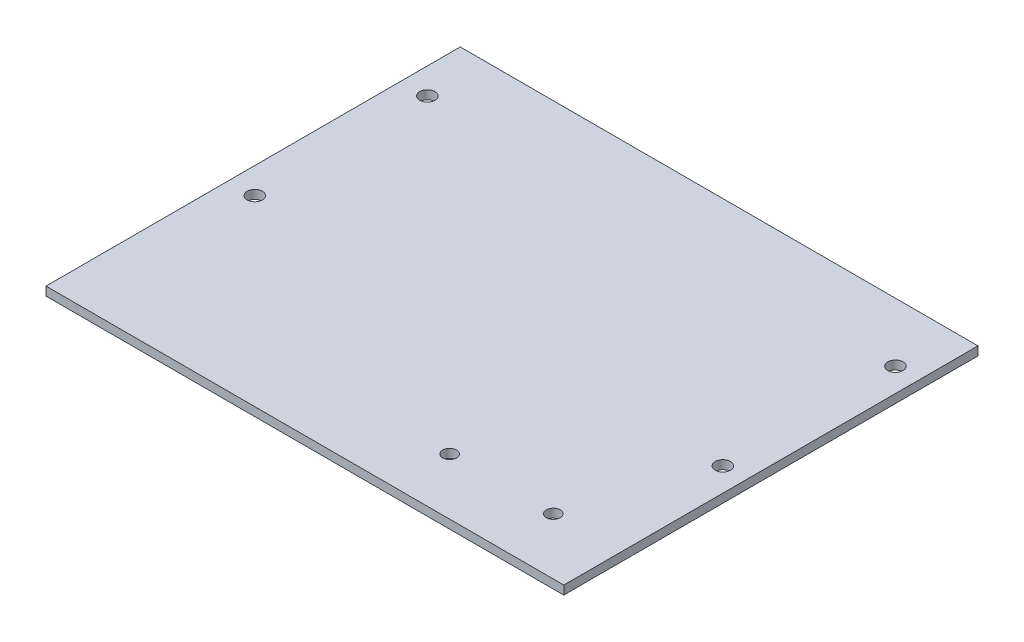
ISO-10303-21;
HEADER;
FILE_DESCRIPTION(('STEP AP214'),'2;1');
FILE_NAME('part.step','',(''),(''),'','','');
FILE_SCHEMA(('AUTOMOTIVE_DESIGN { 1 0 10303 214 1 1 1 1 }'));
ENDSEC;
DATA;
#1=APPLICATION_CONTEXT('core data for automotive mechanical design processes');
#2=APPLICATION_PROTOCOL_DEFINITION('international standard','automotive_design',2000,#1);
#3=PRODUCT_CONTEXT('',#1,'mechanical');
#4=PRODUCT('Part','Part','',(#3));
#5=PRODUCT_RELATED_PRODUCT_CATEGORY('part','',(#4));
#6=PRODUCT_DEFINITION_FORMATION('','',#4);
#7=PRODUCT_DEFINITION_CONTEXT('part definition',#1,'design');
#8=PRODUCT_DEFINITION('design','',#6,#7);
#9=PRODUCT_DEFINITION_SHAPE('','',#8);
#10=(LENGTH_UNIT() NAMED_UNIT(*) SI_UNIT(.MILLI.,.METRE.));
#11=(NAMED_UNIT(*) PLANE_ANGLE_UNIT() SI_UNIT($,.RADIAN.));
#12=(NAMED_UNIT(*) SI_UNIT($,.STERADIAN.) SOLID_ANGLE_UNIT());
#13=UNCERTAINTY_MEASURE_WITH_UNIT(LENGTH_MEASURE(1.E-05),#10,'distance_accuracy_value','');
#14=(GEOMETRIC_REPRESENTATION_CONTEXT(3) GLOBAL_UNCERTAINTY_ASSIGNED_CONTEXT((#13)) GLOBAL_UNIT_ASSIGNED_CONTEXT((#10,
#11,#12)) REPRESENTATION_CONTEXT('',''));
#15=CARTESIAN_POINT('',(0.,0.,0.));
#16=DIRECTION('',(0.,0.,1.));
#17=DIRECTION('',(1.,0.,0.));
#18=AXIS2_PLACEMENT_3D('',#15,#16,#17);
#19=CARTESIAN_POINT('',(44.6344913978495,0.,-5.38329784946236));
#20=DIRECTION('',(0.,1.,0.));
#21=DIRECTION('',(0.,0.,1.));
#22=AXIS2_PLACEMENT_3D('',#19,#20,#21);
#23=CYLINDRICAL_SURFACE('',#22,1.39700000000001);
#24=CARTESIAN_POINT('',(44.6344913978495,0.,-5.38329784946236));
#25=DIRECTION('',(0.,1.,0.));
#26=DIRECTION('',(0.,0.,1.));
#27=AXIS2_PLACEMENT_3D('',#24,#25,#26);
#28=CIRCLE('',#27,1.39700000000001);
#29=CARTESIAN_POINT('',(44.6344913978495,0.,-3.98629784946235));
#30=VERTEX_POINT('',#29);
#31=EDGE_CURVE('E41',#30,#30,#28,.T.);
#32=CARTESIAN_POINT('',(44.6344913978495,1.600000102,-5.38329784946236));
#33=DIRECTION('',(0.,1.,0.));
#34=DIRECTION('',(0.,0.,1.));
#35=AXIS2_PLACEMENT_3D('',#32,#33,#34);
#36=CIRCLE('',#35,1.39700000000001);
#37=CARTESIAN_POINT('',(44.6344913978495,1.600000102,-3.98629784946235));
#38=VERTEX_POINT('',#37);
#39=EDGE_CURVE('E11',#38,#38,#36,.T.);
#40=CARTESIAN_POINT('',(44.6344913978495,0.,-3.98629784946235));
#41=CARTESIAN_POINT('',(44.6344913978495,0.0166666677291667,-3.98629784946235));
#42=CARTESIAN_POINT('',(44.6344913978495,0.0333333354583333,-3.98629784946235));
#43=CARTESIAN_POINT('',(44.6344913978495,0.0666666709166667,-3.98629784946235));
#44=CARTESIAN_POINT('',(44.6344913978495,0.0833333386458333,-3.98629784946235));
#45=CARTESIAN_POINT('',(44.6344913978495,0.116666674104167,-3.98629784946235));
#46=CARTESIAN_POINT('',(44.6344913978495,0.133333341833333,-3.98629784946235));
#47=CARTESIAN_POINT('',(44.6344913978495,0.166666677291667,-3.98629784946235));
#48=CARTESIAN_POINT('',(44.6344913978495,0.183333345020833,-3.98629784946235));
#49=CARTESIAN_POINT('',(44.6344913978495,0.216666680479167,-3.98629784946235));
#50=CARTESIAN_POINT('',(44.6344913978495,0.233333348208333,-3.98629784946235));
#51=CARTESIAN_POINT('',(44.6344913978495,0.266666683666667,-3.98629784946235));
#52=CARTESIAN_POINT('',(44.6344913978495,0.283333351395833,-3.98629784946235));
#53=CARTESIAN_POINT('',(44.6344913978495,0.316666686854167,-3.98629784946235));
#54=CARTESIAN_POINT('',(44.6344913978495,0.333333354583333,-3.98629784946235));
#55=CARTESIAN_POINT('',(44.6344913978495,0.366666690041667,-3.98629784946235));
#56=CARTESIAN_POINT('',(44.6344913978495,0.383333357770833,-3.98629784946235));
#57=CARTESIAN_POINT('',(44.6344913978495,0.416666693229167,-3.98629784946235));
#58=CARTESIAN_POINT('',(44.6344913978495,0.433333360958333,-3.98629784946235));
#59=CARTESIAN_POINT('',(44.6344913978495,0.466666696416667,-3.98629784946235));
#60=CARTESIAN_POINT('',(44.6344913978495,0.483333364145833,-3.98629784946235));
#61=CARTESIAN_POINT('',(44.6344913978495,0.516666699604167,-3.98629784946235));
#62=CARTESIAN_POINT('',(44.6344913978495,0.533333367333333,-3.98629784946235));
#63=CARTESIAN_POINT('',(44.6344913978495,0.566666702791667,-3.98629784946235));
#64=CARTESIAN_POINT('',(44.6344913978495,0.583333370520833,-3.98629784946235));
#65=CARTESIAN_POINT('',(44.6344913978495,0.616666705979167,-3.98629784946235));
#66=CARTESIAN_POINT('',(44.6344913978495,0.633333373708333,-3.98629784946235));
#67=CARTESIAN_POINT('',(44.6344913978495,0.666666709166667,-3.98629784946235));
#68=CARTESIAN_POINT('',(44.6344913978495,0.683333376895833,-3.98629784946235));
#69=CARTESIAN_POINT('',(44.6344913978495,0.716666712354167,-3.98629784946235));
#70=CARTESIAN_POINT('',(44.6344913978495,0.733333380083333,-3.98629784946235));
#71=CARTESIAN_POINT('',(44.6344913978495,0.766666715541667,-3.98629784946235));
#72=CARTESIAN_POINT('',(44.6344913978495,0.783333383270833,-3.98629784946235));
#73=CARTESIAN_POINT('',(44.6344913978495,0.816666718729167,-3.98629784946235));
#74=CARTESIAN_POINT('',(44.6344913978495,0.833333386458333,-3.98629784946235));
#75=CARTESIAN_POINT('',(44.6344913978495,0.866666721916666,-3.98629784946235));
#76=CARTESIAN_POINT('',(44.6344913978495,0.883333389645833,-3.98629784946235));
#77=CARTESIAN_POINT('',(44.6344913978495,0.916666725104166,-3.98629784946235));
#78=CARTESIAN_POINT('',(44.6344913978495,0.933333392833333,-3.98629784946235));
#79=CARTESIAN_POINT('',(44.6344913978495,0.966666728291666,-3.98629784946235));
#80=CARTESIAN_POINT('',(44.6344913978495,0.983333396020833,-3.98629784946235));
#81=CARTESIAN_POINT('',(44.6344913978495,1.01666673147917,-3.98629784946235));
#82=CARTESIAN_POINT('',(44.6344913978495,1.03333339920833,-3.98629784946235));
#83=CARTESIAN_POINT('',(44.6344913978495,1.06666673466667,-3.98629784946235));
#84=CARTESIAN_POINT('',(44.6344913978495,1.08333340239583,-3.98629784946235));
#85=CARTESIAN_POINT('',(44.6344913978495,1.11666673785417,-3.98629784946235));
#86=CARTESIAN_POINT('',(44.6344913978495,1.13333340558333,-3.98629784946235));
#87=CARTESIAN_POINT('',(44.6344913978495,1.16666674104167,-3.98629784946235));
#88=CARTESIAN_POINT('',(44.6344913978495,1.18333340877083,-3.98629784946235));
#89=CARTESIAN_POINT('',(44.6344913978495,1.21666674422917,-3.98629784946235));
#90=CARTESIAN_POINT('',(44.6344913978495,1.23333341195833,-3.98629784946235));
#91=CARTESIAN_POINT('',(44.6344913978495,1.26666674741667,-3.98629784946235));
#92=CARTESIAN_POINT('',(44.6344913978495,1.28333341514583,-3.98629784946235));
#93=CARTESIAN_POINT('',(44.6344913978495,1.31666675060417,-3.98629784946235));
#94=CARTESIAN_POINT('',(44.6344913978495,1.33333341833333,-3.98629784946235));
#95=CARTESIAN_POINT('',(44.6344913978495,1.36666675379167,-3.98629784946235));
#96=CARTESIAN_POINT('',(44.6344913978495,1.38333342152083,-3.98629784946235));
#97=CARTESIAN_POINT('',(44.6344913978495,1.41666675697917,-3.98629784946235));
#98=CARTESIAN_POINT('',(44.6344913978495,1.43333342470833,-3.98629784946235));
#99=CARTESIAN_POINT('',(44.6344913978495,1.46666676016667,-3.98629784946235));
#100=CARTESIAN_POINT('',(44.6344913978495,1.48333342789583,-3.98629784946235));
#101=CARTESIAN_POINT('',(44.6344913978495,1.51666676335417,-3.98629784946235));
#102=CARTESIAN_POINT('',(44.6344913978495,1.53333343108333,-3.98629784946235));
#103=CARTESIAN_POINT('',(44.6344913978495,1.56666676654167,-3.98629784946235));
#104=CARTESIAN_POINT('',(44.6344913978495,1.58333343427083,-3.98629784946235));
#105=CARTESIAN_POINT('',(44.6344913978495,1.600000102,-3.98629784946235));
#106=B_SPLINE_CURVE_WITH_KNOTS('',3,(#40,#41,#42,#43,#44,#45,#46,#47,#48,#49,#50,#51,#52,#53,
#54,#55,#56,#57,#58,#59,#60,#61,#62,#63,#64,#65,#66,#67,#68,#69,#70,#71,#72,#73,#74,#75,#76,#77,
#78,#79,#80,#81,#82,#83,#84,#85,#86,#87,#88,#89,#90,#91,#92,#93,#94,#95,#96,#97,#98,#99,#100,
#101,#102,#103,#104,#105),.UNSPECIFIED.,.F.,.F.,(4,2,2,2,2,2,2,2,2,2,2,2,2,2,2,2,2,2,2,2,2,2,2,
2,2,2,2,2,2,2,2,2,4),(0.,0.0500000031875,0.100000006375,0.1500000095625,0.20000001275,
0.2500000159375,0.300000019125,0.3500000223125,0.4000000255,0.4500000286875,0.500000031875,
0.5500000350625,0.60000003825,0.6500000414375,0.700000044625,0.7500000478125,0.800000051,
0.8500000541875,0.900000057375,0.9500000605625,1.00000006375,1.0500000669375,1.100000070125,
1.1500000733125,1.2000000765,1.2500000796875,1.300000082875,1.3500000860625,1.40000008925,
1.4500000924375,1.500000095625,1.5500000988125,1.600000102),.UNSPECIFIED.);
#107=EDGE_CURVE('BSEAM33',#30,#38,#106,.T.);
#108=ORIENTED_EDGE('',*,*,#31,.F.);
#109=ORIENTED_EDGE('',*,*,#39,.T.);
#110=ORIENTED_EDGE('',*,*,#107,.T.);
#111=ORIENTED_EDGE('',*,*,#107,.F.);
#112=EDGE_LOOP('',(#108,#110,#109,#111));
#113=FACE_BOUND('',#112,.T.);
#114=ADVANCED_FACE('F33',(#113),#23,.F.);
#115=CARTESIAN_POINT('',(-41.4715086021505,0.,-5.38329784946236));
#116=DIRECTION('',(0.,1.,0.));
#117=DIRECTION('',(0.,0.,1.));
#118=AXIS2_PLACEMENT_3D('',#115,#116,#117);
#119=CYLINDRICAL_SURFACE('',#118,1.39700000000001);
#120=CARTESIAN_POINT('',(-41.4715086021505,0.,-5.38329784946236));
#121=DIRECTION('',(0.,1.,0.));
#122=DIRECTION('',(0.,0.,1.));
#123=AXIS2_PLACEMENT_3D('',#120,#121,#122);
#124=CIRCLE('',#123,1.39700000000001);
#125=CARTESIAN_POINT('',(-41.4715086021505,0.,-3.98629784946235));
#126=VERTEX_POINT('',#125);
#127=EDGE_CURVE('E111',#126,#126,#124,.T.);
#128=CARTESIAN_POINT('',(-41.4715086021505,1.600000102,-5.38329784946236));
#129=DIRECTION('',(0.,1.,0.));
#130=DIRECTION('',(0.,0.,1.));
#131=AXIS2_PLACEMENT_3D('',#128,#129,#130);
#132=CIRCLE('',#131,1.39700000000001);
#133=CARTESIAN_POINT('',(-41.4715086021505,1.600000102,-3.98629784946235));
#134=VERTEX_POINT('',#133);
#135=EDGE_CURVE('E114',#134,#134,#132,.T.);
#136=CARTESIAN_POINT('',(-41.4715086021505,0.,-3.98629784946235));
#137=CARTESIAN_POINT('',(-41.4715086021505,0.0166666677291667,-3.98629784946235));
#138=CARTESIAN_POINT('',(-41.4715086021505,0.0333333354583333,-3.98629784946235));
#139=CARTESIAN_POINT('',(-41.4715086021505,0.0666666709166667,-3.98629784946235));
#140=CARTESIAN_POINT('',(-41.4715086021505,0.0833333386458333,-3.98629784946235));
#141=CARTESIAN_POINT('',(-41.4715086021505,0.116666674104167,-3.98629784946235));
#142=CARTESIAN_POINT('',(-41.4715086021505,0.133333341833333,-3.98629784946235));
#143=CARTESIAN_POINT('',(-41.4715086021505,0.166666677291667,-3.98629784946235));
#144=CARTESIAN_POINT('',(-41.4715086021505,0.183333345020833,-3.98629784946235));
#145=CARTESIAN_POINT('',(-41.4715086021505,0.216666680479167,-3.98629784946235));
#146=CARTESIAN_POINT('',(-41.4715086021505,0.233333348208333,-3.98629784946235));
#147=CARTESIAN_POINT('',(-41.4715086021505,0.266666683666667,-3.98629784946235));
#148=CARTESIAN_POINT('',(-41.4715086021505,0.283333351395833,-3.98629784946235));
#149=CARTESIAN_POINT('',(-41.4715086021505,0.316666686854167,-3.98629784946235));
#150=CARTESIAN_POINT('',(-41.4715086021505,0.333333354583333,-3.98629784946235));
#151=CARTESIAN_POINT('',(-41.4715086021505,0.366666690041667,-3.98629784946235));
#152=CARTESIAN_POINT('',(-41.4715086021505,0.383333357770833,-3.98629784946235));
#153=CARTESIAN_POINT('',(-41.4715086021505,0.416666693229167,-3.98629784946235));
#154=CARTESIAN_POINT('',(-41.4715086021505,0.433333360958333,-3.98629784946235));
#155=CARTESIAN_POINT('',(-41.4715086021505,0.466666696416667,-3.98629784946235));
#156=CARTESIAN_POINT('',(-41.4715086021505,0.483333364145833,-3.98629784946235));
#157=CARTESIAN_POINT('',(-41.4715086021505,0.516666699604167,-3.98629784946235));
#158=CARTESIAN_POINT('',(-41.4715086021505,0.533333367333333,-3.98629784946235));
#159=CARTESIAN_POINT('',(-41.4715086021505,0.566666702791667,-3.98629784946235));
#160=CARTESIAN_POINT('',(-41.4715086021505,0.583333370520833,-3.98629784946235));
#161=CARTESIAN_POINT('',(-41.4715086021505,0.616666705979167,-3.98629784946235));
#162=CARTESIAN_POINT('',(-41.4715086021505,0.633333373708333,-3.98629784946235));
#163=CARTESIAN_POINT('',(-41.4715086021505,0.666666709166667,-3.98629784946235));
#164=CARTESIAN_POINT('',(-41.4715086021505,0.683333376895833,-3.98629784946235));
#165=CARTESIAN_POINT('',(-41.4715086021505,0.716666712354167,-3.98629784946235));
#166=CARTESIAN_POINT('',(-41.4715086021505,0.733333380083333,-3.98629784946235));
#167=CARTESIAN_POINT('',(-41.4715086021505,0.766666715541667,-3.98629784946235));
#168=CARTESIAN_POINT('',(-41.4715086021505,0.783333383270833,-3.98629784946235));
#169=CARTESIAN_POINT('',(-41.4715086021505,0.816666718729167,-3.98629784946235));
#170=CARTESIAN_POINT('',(-41.4715086021505,0.833333386458333,-3.98629784946235));
#171=CARTESIAN_POINT('',(-41.4715086021505,0.866666721916666,-3.98629784946235));
#172=CARTESIAN_POINT('',(-41.4715086021505,0.883333389645833,-3.98629784946235));
#173=CARTESIAN_POINT('',(-41.4715086021505,0.916666725104166,-3.98629784946235));
#174=CARTESIAN_POINT('',(-41.4715086021505,0.933333392833333,-3.98629784946235));
#175=CARTESIAN_POINT('',(-41.4715086021505,0.966666728291666,-3.98629784946235));
#176=CARTESIAN_POINT('',(-41.4715086021505,0.983333396020833,-3.98629784946235));
#177=CARTESIAN_POINT('',(-41.4715086021505,1.01666673147917,-3.98629784946235));
#178=CARTESIAN_POINT('',(-41.4715086021505,1.03333339920833,-3.98629784946235));
#179=CARTESIAN_POINT('',(-41.4715086021505,1.06666673466667,-3.98629784946235));
#180=CARTESIAN_POINT('',(-41.4715086021505,1.08333340239583,-3.98629784946235));
#181=CARTESIAN_POINT('',(-41.4715086021505,1.11666673785417,-3.98629784946235));
#182=CARTESIAN_POINT('',(-41.4715086021505,1.13333340558333,-3.98629784946235));
#183=CARTESIAN_POINT('',(-41.4715086021505,1.16666674104167,-3.98629784946235));
#184=CARTESIAN_POINT('',(-41.4715086021505,1.18333340877083,-3.98629784946235));
#185=CARTESIAN_POINT('',(-41.4715086021505,1.21666674422917,-3.98629784946235));
#186=CARTESIAN_POINT('',(-41.4715086021505,1.23333341195833,-3.98629784946235));
#187=CARTESIAN_POINT('',(-41.4715086021505,1.26666674741667,-3.98629784946235));
#188=CARTESIAN_POINT('',(-41.4715086021505,1.28333341514583,-3.98629784946235));
#189=CARTESIAN_POINT('',(-41.4715086021505,1.31666675060417,-3.98629784946235));
#190=CARTESIAN_POINT('',(-41.4715086021505,1.33333341833333,-3.98629784946235));
#191=CARTESIAN_POINT('',(-41.4715086021505,1.36666675379167,-3.98629784946235));
#192=CARTESIAN_POINT('',(-41.4715086021505,1.38333342152083,-3.98629784946235));
#193=CARTESIAN_POINT('',(-41.4715086021505,1.41666675697917,-3.98629784946235));
#194=CARTESIAN_POINT('',(-41.4715086021505,1.43333342470833,-3.98629784946235));
#195=CARTESIAN_POINT('',(-41.4715086021505,1.46666676016667,-3.98629784946235));
#196=CARTESIAN_POINT('',(-41.4715086021505,1.48333342789583,-3.98629784946235));
#197=CARTESIAN_POINT('',(-41.4715086021505,1.51666676335417,-3.98629784946235));
#198=CARTESIAN_POINT('',(-41.4715086021505,1.53333343108333,-3.98629784946235));
#199=CARTESIAN_POINT('',(-41.4715086021505,1.56666676654167,-3.98629784946235));
#200=CARTESIAN_POINT('',(-41.4715086021505,1.58333343427083,-3.98629784946235));
#201=CARTESIAN_POINT('',(-41.4715086021505,1.600000102,-3.98629784946235));
#202=B_SPLINE_CURVE_WITH_KNOTS('',3,(#136,#137,#138,#139,#140,#141,#142,#143,#144,#145,#146,
#147,#148,#149,#150,#151,#152,#153,#154,#155,#156,#157,#158,#159,#160,#161,#162,#163,#164,#165,
#166,#167,#168,#169,#170,#171,#172,#173,#174,#175,#176,#177,#178,#179,#180,#181,#182,#183,#184,
#185,#186,#187,#188,#189,#190,#191,#192,#193,#194,#195,#196,#197,#198,#199,#200,#201),
.UNSPECIFIED.,.F.,.F.,(4,2,2,2,2,2,2,2,2,2,2,2,2,2,2,2,2,2,2,2,2,2,2,2,2,2,2,2,2,2,2,2,4),(0.,
0.0500000031875,0.100000006375,0.1500000095625,0.20000001275,0.2500000159375,0.300000019125,
0.3500000223125,0.4000000255,0.4500000286875,0.500000031875,0.5500000350625,0.60000003825,
0.6500000414375,0.700000044625,0.7500000478125,0.800000051,0.8500000541875,0.900000057375,
0.9500000605625,1.00000006375,1.0500000669375,1.100000070125,1.1500000733125,1.2000000765,
1.2500000796875,1.300000082875,1.3500000860625,1.40000008925,1.4500000924375,1.500000095625,
1.5500000988125,1.600000102),.UNSPECIFIED.);
#203=EDGE_CURVE('BSEAM123',#126,#134,#202,.T.);
#204=ORIENTED_EDGE('',*,*,#127,.F.);
#205=ORIENTED_EDGE('',*,*,#135,.T.);
#206=ORIENTED_EDGE('',*,*,#203,.T.);
#207=ORIENTED_EDGE('',*,*,#203,.F.);
#208=EDGE_LOOP('',(#204,#206,#205,#207));
#209=FACE_BOUND('',#208,.T.);
#210=ADVANCED_FACE('F123',(#209),#119,.F.);
#211=CARTESIAN_POINT('',(-46.2594086021505,1.600000102,-47.9663978494624));
#212=DIRECTION('',(1.,0.,0.));
#213=DIRECTION('',(0.,0.,-1.));
#214=AXIS2_PLACEMENT_3D('',#211,#212,#213);
#215=PLANE('',#214);
#216=DIRECTION('',(0.,0.,1.));
#217=VECTOR('',#216,1.);
#218=CARTESIAN_POINT('',(-46.2594086021505,0.,-47.9663978494624));
#219=LINE('',#218,#217);
#220=CARTESIAN_POINT('',(-46.2594086021505,0.,-47.9663978494624));
#221=VERTEX_POINT('',#220);
#222=CARTESIAN_POINT('',(-46.2594086021505,0.,28.2336021505376));
#223=VERTEX_POINT('',#222);
#224=EDGE_CURVE('E101',#221,#223,#219,.T.);
#225=ORIENTED_EDGE('',*,*,#224,.T.);
#226=DIRECTION('',(0.,-1.,0.));
#227=VECTOR('',#226,1.);
#228=CARTESIAN_POINT('',(-46.2594086021505,1.600000102,28.2336021505376));
#229=LINE('',#228,#227);
#230=CARTESIAN_POINT('',(-46.2594086021505,1.600000102,28.2336021505376));
#231=VERTEX_POINT('',#230);
#232=EDGE_CURVE('E92',#231,#223,#229,.T.);
#233=ORIENTED_EDGE('',*,*,#232,.F.);
#234=DIRECTION('',(0.,0.,1.));
#235=VECTOR('',#234,1.);
#236=CARTESIAN_POINT('',(-46.2594086021505,1.600000102,-47.9663978494624));
#237=LINE('',#236,#235);
#238=CARTESIAN_POINT('',(-46.2594086021505,1.600000102,-47.9663978494624));
#239=VERTEX_POINT('',#238);
#240=EDGE_CURVE('E86',#239,#231,#237,.T.);
#241=ORIENTED_EDGE('',*,*,#240,.F.);
#242=DIRECTION('',(0.,-1.,0.));
#243=VECTOR('',#242,1.);
#244=CARTESIAN_POINT('',(-46.2594086021505,1.600000102,-47.9663978494624));
#245=LINE('',#244,#243);
#246=EDGE_CURVE('E97',#239,#221,#245,.T.);
#247=ORIENTED_EDGE('',*,*,#246,.T.);
#248=EDGE_LOOP('',(#225,#233,#241,#247));
#249=FACE_BOUND('',#248,.T.);
#250=ADVANCED_FACE('F148',(#249),#215,.F.);
#251=CARTESIAN_POINT('',(-46.2594086021505,1.600000102,28.2336021505376));
#252=DIRECTION('',(0.,0.,-1.));
#253=DIRECTION('',(-1.,0.,0.));
#254=AXIS2_PLACEMENT_3D('',#251,#252,#253);
#255=PLANE('',#254);
#256=DIRECTION('',(1.,0.,0.));
#257=VECTOR('',#256,1.);
#258=CARTESIAN_POINT('',(-46.2594086021505,0.,28.2336021505376));
#259=LINE('',#258,#257);
#260=CARTESIAN_POINT('',(48.9905913978495,0.,28.2336021505376));
#261=VERTEX_POINT('',#260);
#262=EDGE_CURVE('E91',#223,#261,#259,.T.);
#263=ORIENTED_EDGE('',*,*,#262,.T.);
#264=DIRECTION('',(0.,-1.,0.));
#265=VECTOR('',#264,1.);
#266=CARTESIAN_POINT('',(48.9905913978495,1.600000102,28.2336021505376));
#267=LINE('',#266,#265);
#268=CARTESIAN_POINT('',(48.9905913978495,1.600000102,28.2336021505376));
#269=VERTEX_POINT('',#268);
#270=EDGE_CURVE('E89',#269,#261,#267,.T.);
#271=ORIENTED_EDGE('',*,*,#270,.F.);
#272=DIRECTION('',(1.,0.,0.));
#273=VECTOR('',#272,1.);
#274=CARTESIAN_POINT('',(-46.2594086021505,1.600000102,28.2336021505376));
#275=LINE('',#274,#273);
#276=EDGE_CURVE('E80',#231,#269,#275,.T.);
#277=ORIENTED_EDGE('',*,*,#276,.F.);
#278=ORIENTED_EDGE('',*,*,#232,.T.);
#279=EDGE_LOOP('',(#263,#271,#277,#278));
#280=FACE_BOUND('',#279,.T.);
#281=ADVANCED_FACE('F90',(#280),#255,.F.);
#282=CARTESIAN_POINT('',(48.9905913978495,1.600000102,-47.9663978494624));
#283=DIRECTION('',(-1.,0.,0.));
#284=DIRECTION('',(0.,0.,1.));
#285=AXIS2_PLACEMENT_3D('',#282,#283,#284);
#286=PLANE('',#285);
#287=DIRECTION('',(0.,0.,-1.));
#288=VECTOR('',#287,1.);
#289=CARTESIAN_POINT('',(48.9905913978495,0.,-47.9663978494624));
#290=LINE('',#289,#288);
#291=CARTESIAN_POINT('',(48.9905913978495,0.,-47.9663978494624));
#292=VERTEX_POINT('',#291);
#293=EDGE_CURVE('E66',#261,#292,#290,.T.);
#294=ORIENTED_EDGE('',*,*,#293,.T.);
#295=DIRECTION('',(0.,-1.,0.));
#296=VECTOR('',#295,1.);
#297=CARTESIAN_POINT('',(48.9905913978495,1.600000102,-47.9663978494624));
#298=LINE('',#297,#296);
#299=CARTESIAN_POINT('',(48.9905913978495,1.600000102,-47.9663978494624));
#300=VERTEX_POINT('',#299);
#301=EDGE_CURVE('E93',#300,#292,#298,.T.);
#302=ORIENTED_EDGE('',*,*,#301,.F.);
#303=DIRECTION('',(0.,0.,-1.));
#304=VECTOR('',#303,1.);
#305=CARTESIAN_POINT('',(48.9905913978495,1.600000102,-47.9663978494624));
#306=LINE('',#305,#304);
#307=EDGE_CURVE('E84',#269,#300,#306,.T.);
#308=ORIENTED_EDGE('',*,*,#307,.F.);
#309=ORIENTED_EDGE('',*,*,#270,.T.);
#310=EDGE_LOOP('',(#294,#302,#308,#309));
#311=FACE_BOUND('',#310,.T.);
#312=ADVANCED_FACE('F95',(#311),#286,.F.);
#313=CARTESIAN_POINT('',(-46.2594086021505,1.600000102,-47.9663978494624));
#314=DIRECTION('',(0.,0.,1.));
#315=DIRECTION('',(1.,0.,0.));
#316=AXIS2_PLACEMENT_3D('',#313,#314,#315);
#317=PLANE('',#316);
#318=DIRECTION('',(-1.,0.,0.));
#319=VECTOR('',#318,1.);
#320=CARTESIAN_POINT('',(-46.2594086021505,0.,-47.9663978494624));
#321=LINE('',#320,#319);
#322=EDGE_CURVE('E72',#292,#221,#321,.T.);
#323=ORIENTED_EDGE('',*,*,#322,.T.);
#324=ORIENTED_EDGE('',*,*,#246,.F.);
#325=DIRECTION('',(-1.,0.,0.));
#326=VECTOR('',#325,1.);
#327=CARTESIAN_POINT('',(-46.2594086021505,1.600000102,-47.9663978494624));
#328=LINE('',#327,#326);
#329=EDGE_CURVE('E49',#300,#239,#328,.T.);
#330=ORIENTED_EDGE('',*,*,#329,.F.);
#331=ORIENTED_EDGE('',*,*,#301,.T.);
#332=EDGE_LOOP('',(#323,#324,#330,#331));
#333=FACE_BOUND('',#332,.T.);
#334=ADVANCED_FACE('F127',(#333),#317,.F.);
#335=CARTESIAN_POINT('',(0.,1.600000102,0.));
#336=DIRECTION('',(0.,1.,0.));
#337=DIRECTION('',(0.,0.,1.));
#338=AXIS2_PLACEMENT_3D('',#335,#336,#337);
#339=PLANE('',#338);
#340=CARTESIAN_POINT('',(36.6635559311404,1.600000102,17.8572201418976));
#341=DIRECTION('',(0.,1.,0.));
#342=DIRECTION('',(0.,0.,1.));
#343=AXIS2_PLACEMENT_3D('',#340,#341,#342);
#344=CIRCLE('',#343,1.27);
#345=CARTESIAN_POINT('',(36.6635559311404,1.600000102,19.1272201418976));
#346=VERTEX_POINT('',#345);
#347=EDGE_CURVE('E244',#346,#346,#344,.T.);
#348=ORIENTED_EDGE('',*,*,#347,.F.);
#349=EDGE_LOOP('',(#348));
#350=FACE_BOUND('',#349,.T.);
#351=CARTESIAN_POINT('',(17.6135559311404,1.600000102,17.8572201418976));
#352=DIRECTION('',(0.,1.,0.));
#353=DIRECTION('',(0.,0.,1.));
#354=AXIS2_PLACEMENT_3D('',#351,#352,#353);
#355=CIRCLE('',#354,1.27);
#356=CARTESIAN_POINT('',(17.6135559311404,1.600000102,19.1272201418976));
#357=VERTEX_POINT('',#356);
#358=EDGE_CURVE('E246',#357,#357,#355,.T.);
#359=ORIENTED_EDGE('',*,*,#358,.F.);
#360=EDGE_LOOP('',(#359));
#361=FACE_BOUND('',#360,.T.);
#362=CARTESIAN_POINT('',(44.6344913978495,1.600000102,-37.1332978494624));
#363=DIRECTION('',(0.,1.,0.));
#364=DIRECTION('',(0.,0.,1.));
#365=AXIS2_PLACEMENT_3D('',#362,#363,#364);
#366=CIRCLE('',#365,1.39700000000001);
#367=CARTESIAN_POINT('',(44.6344913978495,1.600000102,-35.7362978494624));
#368=VERTEX_POINT('',#367);
#369=EDGE_CURVE('E257',#368,#368,#366,.T.);
#370=ORIENTED_EDGE('',*,*,#369,.F.);
#371=EDGE_LOOP('',(#370));
#372=FACE_BOUND('',#371,.T.);
#373=CARTESIAN_POINT('',(-41.4715086021505,1.600000102,-37.1332978494624));
#374=DIRECTION('',(0.,1.,0.));
#375=DIRECTION('',(0.,0.,1.));
#376=AXIS2_PLACEMENT_3D('',#373,#374,#375);
#377=CIRCLE('',#376,1.39700000000001);
#378=CARTESIAN_POINT('',(-41.4715086021505,1.600000102,-35.7362978494624));
#379=VERTEX_POINT('',#378);
#380=EDGE_CURVE('E260',#379,#379,#377,.T.);
#381=ORIENTED_EDGE('',*,*,#380,.F.);
#382=EDGE_LOOP('',(#381));
#383=FACE_BOUND('',#382,.T.);
#384=ORIENTED_EDGE('',*,*,#240,.T.);
#385=ORIENTED_EDGE('',*,*,#276,.T.);
#386=ORIENTED_EDGE('',*,*,#307,.T.);
#387=ORIENTED_EDGE('',*,*,#329,.T.);
#388=EDGE_LOOP('',(#384,#385,#386,#387));
#389=FACE_BOUND('',#388,.T.);
#390=ORIENTED_EDGE('',*,*,#135,.F.);
#391=EDGE_LOOP('',(#390));
#392=FACE_BOUND('',#391,.T.);
#393=ORIENTED_EDGE('',*,*,#39,.F.);
#394=EDGE_LOOP('',(#393));
#395=FACE_BOUND('',#394,.T.);
#396=ADVANCED_FACE('F81',(#350,#361,#372,#383,#389,#392,#395),#339,.T.);
#397=CARTESIAN_POINT('',(0.,0.,0.));
#398=DIRECTION('',(0.,1.,0.));
#399=DIRECTION('',(0.,0.,1.));
#400=AXIS2_PLACEMENT_3D('',#397,#398,#399);
#401=PLANE('',#400);
#402=CARTESIAN_POINT('',(36.6635559311404,0.,17.8572201418976));
#403=DIRECTION('',(0.,1.,0.));
#404=DIRECTION('',(0.,0.,1.));
#405=AXIS2_PLACEMENT_3D('',#402,#403,#404);
#406=CIRCLE('',#405,1.27);
#407=CARTESIAN_POINT('',(36.6635559311404,0.,19.1272201418976));
#408=VERTEX_POINT('',#407);
#409=EDGE_CURVE('E242',#408,#408,#406,.T.);
#410=ORIENTED_EDGE('',*,*,#409,.T.);
#411=EDGE_LOOP('',(#410));
#412=FACE_BOUND('',#411,.T.);
#413=CARTESIAN_POINT('',(17.6135559311404,0.,17.8572201418976));
#414=DIRECTION('',(0.,1.,0.));
#415=DIRECTION('',(0.,0.,1.));
#416=AXIS2_PLACEMENT_3D('',#413,#414,#415);
#417=CIRCLE('',#416,1.27);
#418=CARTESIAN_POINT('',(17.6135559311404,0.,19.1272201418976));
#419=VERTEX_POINT('',#418);
#420=EDGE_CURVE('E249',#419,#419,#417,.T.);
#421=ORIENTED_EDGE('',*,*,#420,.T.);
#422=EDGE_LOOP('',(#421));
#423=FACE_BOUND('',#422,.T.);
#424=CARTESIAN_POINT('',(44.6344913978495,0.,-37.1332978494624));
#425=DIRECTION('',(0.,1.,0.));
#426=DIRECTION('',(0.,0.,1.));
#427=AXIS2_PLACEMENT_3D('',#424,#425,#426);
#428=CIRCLE('',#427,1.39700000000001);
#429=CARTESIAN_POINT('',(44.6344913978495,0.,-35.7362978494624));
#430=VERTEX_POINT('',#429);
#431=EDGE_CURVE('E252',#430,#430,#428,.T.);
#432=ORIENTED_EDGE('',*,*,#431,.T.);
#433=EDGE_LOOP('',(#432));
#434=FACE_BOUND('',#433,.T.);
#435=CARTESIAN_POINT('',(-41.4715086021505,0.,-37.1332978494624));
#436=DIRECTION('',(0.,1.,0.));
#437=DIRECTION('',(0.,0.,1.));
#438=AXIS2_PLACEMENT_3D('',#435,#436,#437);
#439=CIRCLE('',#438,1.39700000000001);
#440=CARTESIAN_POINT('',(-41.4715086021505,0.,-35.7362978494624));
#441=VERTEX_POINT('',#440);
#442=EDGE_CURVE('E104',#441,#441,#439,.T.);
#443=ORIENTED_EDGE('',*,*,#442,.T.);
#444=EDGE_LOOP('',(#443));
#445=FACE_BOUND('',#444,.T.);
#446=ORIENTED_EDGE('',*,*,#224,.F.);
#447=ORIENTED_EDGE('',*,*,#322,.F.);
#448=ORIENTED_EDGE('',*,*,#293,.F.);
#449=ORIENTED_EDGE('',*,*,#262,.F.);
#450=EDGE_LOOP('',(#446,#447,#448,#449));
#451=FACE_BOUND('',#450,.T.);
#452=ORIENTED_EDGE('',*,*,#127,.T.);
#453=EDGE_LOOP('',(#452));
#454=FACE_BOUND('',#453,.T.);
#455=ORIENTED_EDGE('',*,*,#31,.T.);
#456=EDGE_LOOP('',(#455));
#457=FACE_BOUND('',#456,.T.);
#458=ADVANCED_FACE('F119',(#412,#423,#434,#445,#451,#454,#457),#401,.F.);
#459=CARTESIAN_POINT('',(-41.4715086021505,0.,-37.1332978494624));
#460=DIRECTION('',(0.,1.,0.));
#461=DIRECTION('',(0.,0.,1.));
#462=AXIS2_PLACEMENT_3D('',#459,#460,#461);
#463=CYLINDRICAL_SURFACE('',#462,1.39700000000001);
#464=CARTESIAN_POINT('',(-41.4715086021505,0.,-35.7362978494624));
#465=CARTESIAN_POINT('',(-41.4715086021505,0.0166666677291667,-35.7362978494624));
#466=CARTESIAN_POINT('',(-41.4715086021505,0.0333333354583333,-35.7362978494624));
#467=CARTESIAN_POINT('',(-41.4715086021505,0.0666666709166667,-35.7362978494624));
#468=CARTESIAN_POINT('',(-41.4715086021505,0.0833333386458333,-35.7362978494624));
#469=CARTESIAN_POINT('',(-41.4715086021505,0.116666674104167,-35.7362978494624));
#470=CARTESIAN_POINT('',(-41.4715086021505,0.133333341833333,-35.7362978494624));
#471=CARTESIAN_POINT('',(-41.4715086021505,0.166666677291667,-35.7362978494624));
#472=CARTESIAN_POINT('',(-41.4715086021505,0.183333345020833,-35.7362978494624));
#473=CARTESIAN_POINT('',(-41.4715086021505,0.216666680479167,-35.7362978494624));
#474=CARTESIAN_POINT('',(-41.4715086021505,0.233333348208333,-35.7362978494624));
#475=CARTESIAN_POINT('',(-41.4715086021505,0.266666683666667,-35.7362978494624));
#476=CARTESIAN_POINT('',(-41.4715086021505,0.283333351395833,-35.7362978494624));
#477=CARTESIAN_POINT('',(-41.4715086021505,0.316666686854167,-35.7362978494624));
#478=CARTESIAN_POINT('',(-41.4715086021505,0.333333354583333,-35.7362978494624));
#479=CARTESIAN_POINT('',(-41.4715086021505,0.366666690041667,-35.7362978494624));
#480=CARTESIAN_POINT('',(-41.4715086021505,0.383333357770833,-35.7362978494624));
#481=CARTESIAN_POINT('',(-41.4715086021505,0.416666693229167,-35.7362978494624));
#482=CARTESIAN_POINT('',(-41.4715086021505,0.433333360958333,-35.7362978494624));
#483=CARTESIAN_POINT('',(-41.4715086021505,0.466666696416667,-35.7362978494624));
#484=CARTESIAN_POINT('',(-41.4715086021505,0.483333364145833,-35.7362978494624));
#485=CARTESIAN_POINT('',(-41.4715086021505,0.516666699604167,-35.7362978494624));
#486=CARTESIAN_POINT('',(-41.4715086021505,0.533333367333333,-35.7362978494624));
#487=CARTESIAN_POINT('',(-41.4715086021505,0.566666702791667,-35.7362978494624));
#488=CARTESIAN_POINT('',(-41.4715086021505,0.583333370520833,-35.7362978494624));
#489=CARTESIAN_POINT('',(-41.4715086021505,0.616666705979167,-35.7362978494624));
#490=CARTESIAN_POINT('',(-41.4715086021505,0.633333373708333,-35.7362978494624));
#491=CARTESIAN_POINT('',(-41.4715086021505,0.666666709166667,-35.7362978494624));
#492=CARTESIAN_POINT('',(-41.4715086021505,0.683333376895833,-35.7362978494624));
#493=CARTESIAN_POINT('',(-41.4715086021505,0.716666712354167,-35.7362978494624));
#494=CARTESIAN_POINT('',(-41.4715086021505,0.733333380083333,-35.7362978494624));
#495=CARTESIAN_POINT('',(-41.4715086021505,0.766666715541667,-35.7362978494624));
#496=CARTESIAN_POINT('',(-41.4715086021505,0.783333383270833,-35.7362978494624));
#497=CARTESIAN_POINT('',(-41.4715086021505,0.816666718729167,-35.7362978494624));
#498=CARTESIAN_POINT('',(-41.4715086021505,0.833333386458333,-35.7362978494624));
#499=CARTESIAN_POINT('',(-41.4715086021505,0.866666721916666,-35.7362978494624));
#500=CARTESIAN_POINT('',(-41.4715086021505,0.883333389645833,-35.7362978494624));
#501=CARTESIAN_POINT('',(-41.4715086021505,0.916666725104166,-35.7362978494624));
#502=CARTESIAN_POINT('',(-41.4715086021505,0.933333392833333,-35.7362978494624));
#503=CARTESIAN_POINT('',(-41.4715086021505,0.966666728291666,-35.7362978494624));
#504=CARTESIAN_POINT('',(-41.4715086021505,0.983333396020833,-35.7362978494624));
#505=CARTESIAN_POINT('',(-41.4715086021505,1.01666673147917,-35.7362978494624));
#506=CARTESIAN_POINT('',(-41.4715086021505,1.03333339920833,-35.7362978494624));
#507=CARTESIAN_POINT('',(-41.4715086021505,1.06666673466667,-35.7362978494624));
#508=CARTESIAN_POINT('',(-41.4715086021505,1.08333340239583,-35.7362978494624));
#509=CARTESIAN_POINT('',(-41.4715086021505,1.11666673785417,-35.7362978494624));
#510=CARTESIAN_POINT('',(-41.4715086021505,1.13333340558333,-35.7362978494624));
#511=CARTESIAN_POINT('',(-41.4715086021505,1.16666674104167,-35.7362978494624));
#512=CARTESIAN_POINT('',(-41.4715086021505,1.18333340877083,-35.7362978494624));
#513=CARTESIAN_POINT('',(-41.4715086021505,1.21666674422917,-35.7362978494624));
#514=CARTESIAN_POINT('',(-41.4715086021505,1.23333341195833,-35.7362978494624));
#515=CARTESIAN_POINT('',(-41.4715086021505,1.26666674741667,-35.7362978494624));
#516=CARTESIAN_POINT('',(-41.4715086021505,1.28333341514583,-35.7362978494624));
#517=CARTESIAN_POINT('',(-41.4715086021505,1.31666675060417,-35.7362978494624));
#518=CARTESIAN_POINT('',(-41.4715086021505,1.33333341833333,-35.7362978494624));
#519=CARTESIAN_POINT('',(-41.4715086021505,1.36666675379167,-35.7362978494624));
#520=CARTESIAN_POINT('',(-41.4715086021505,1.38333342152083,-35.7362978494624));
#521=CARTESIAN_POINT('',(-41.4715086021505,1.41666675697917,-35.7362978494624));
#522=CARTESIAN_POINT('',(-41.4715086021505,1.43333342470833,-35.7362978494624));
#523=CARTESIAN_POINT('',(-41.4715086021505,1.46666676016667,-35.7362978494624));
#524=CARTESIAN_POINT('',(-41.4715086021505,1.48333342789583,-35.7362978494624));
#525=CARTESIAN_POINT('',(-41.4715086021505,1.51666676335417,-35.7362978494624));
#526=CARTESIAN_POINT('',(-41.4715086021505,1.53333343108333,-35.7362978494624));
#527=CARTESIAN_POINT('',(-41.4715086021505,1.56666676654167,-35.7362978494624));
#528=CARTESIAN_POINT('',(-41.4715086021505,1.58333343427083,-35.7362978494624));
#529=CARTESIAN_POINT('',(-41.4715086021505,1.600000102,-35.7362978494624));
#530=B_SPLINE_CURVE_WITH_KNOTS('',3,(#464,#465,#466,#467,#468,#469,#470,#471,#472,#473,#474,
#475,#476,#477,#478,#479,#480,#481,#482,#483,#484,#485,#486,#487,#488,#489,#490,#491,#492,#493,
#494,#495,#496,#497,#498,#499,#500,#501,#502,#503,#504,#505,#506,#507,#508,#509,#510,#511,#512,
#513,#514,#515,#516,#517,#518,#519,#520,#521,#522,#523,#524,#525,#526,#527,#528,#529),
.UNSPECIFIED.,.F.,.F.,(4,2,2,2,2,2,2,2,2,2,2,2,2,2,2,2,2,2,2,2,2,2,2,2,2,2,2,2,2,2,2,2,4),(0.,
0.0500000031875,0.100000006375,0.1500000095625,0.20000001275,0.2500000159375,0.300000019125,
0.3500000223125,0.4000000255,0.4500000286875,0.500000031875,0.5500000350625,0.60000003825,
0.6500000414375,0.700000044625,0.7500000478125,0.800000051,0.8500000541875,0.900000057375,
0.9500000605625,1.00000006375,1.0500000669375,1.100000070125,1.1500000733125,1.2000000765,
1.2500000796875,1.300000082875,1.3500000860625,1.40000008925,1.4500000924375,1.500000095625,
1.5500000988125,1.600000102),.UNSPECIFIED.);
#531=EDGE_CURVE('BSEAM134',#441,#379,#530,.T.);
#532=ORIENTED_EDGE('',*,*,#442,.F.);
#533=ORIENTED_EDGE('',*,*,#380,.T.);
#534=ORIENTED_EDGE('',*,*,#531,.T.);
#535=ORIENTED_EDGE('',*,*,#531,.F.);
#536=EDGE_LOOP('',(#532,#534,#533,#535));
#537=FACE_BOUND('',#536,.T.);
#538=ADVANCED_FACE('F134',(#537),#463,.F.);
#539=CARTESIAN_POINT('',(44.6344913978495,0.,-37.1332978494624));
#540=DIRECTION('',(0.,1.,0.));
#541=DIRECTION('',(0.,0.,1.));
#542=AXIS2_PLACEMENT_3D('',#539,#540,#541);
#543=CYLINDRICAL_SURFACE('',#542,1.39700000000001);
#544=CARTESIAN_POINT('',(44.6344913978495,0.,-35.7362978494624));
#545=CARTESIAN_POINT('',(44.6344913978495,0.0166666677291667,-35.7362978494624));
#546=CARTESIAN_POINT('',(44.6344913978495,0.0333333354583333,-35.7362978494624));
#547=CARTESIAN_POINT('',(44.6344913978495,0.0666666709166667,-35.7362978494624));
#548=CARTESIAN_POINT('',(44.6344913978495,0.0833333386458333,-35.7362978494624));
#549=CARTESIAN_POINT('',(44.6344913978495,0.116666674104167,-35.7362978494624));
#550=CARTESIAN_POINT('',(44.6344913978495,0.133333341833333,-35.7362978494624));
#551=CARTESIAN_POINT('',(44.6344913978495,0.166666677291667,-35.7362978494624));
#552=CARTESIAN_POINT('',(44.6344913978495,0.183333345020833,-35.7362978494624));
#553=CARTESIAN_POINT('',(44.6344913978495,0.216666680479167,-35.7362978494624));
#554=CARTESIAN_POINT('',(44.6344913978495,0.233333348208333,-35.7362978494624));
#555=CARTESIAN_POINT('',(44.6344913978495,0.266666683666667,-35.7362978494624));
#556=CARTESIAN_POINT('',(44.6344913978495,0.283333351395833,-35.7362978494624));
#557=CARTESIAN_POINT('',(44.6344913978495,0.316666686854167,-35.7362978494624));
#558=CARTESIAN_POINT('',(44.6344913978495,0.333333354583333,-35.7362978494624));
#559=CARTESIAN_POINT('',(44.6344913978495,0.366666690041667,-35.7362978494624));
#560=CARTESIAN_POINT('',(44.6344913978495,0.383333357770833,-35.7362978494624));
#561=CARTESIAN_POINT('',(44.6344913978495,0.416666693229167,-35.7362978494624));
#562=CARTESIAN_POINT('',(44.6344913978495,0.433333360958333,-35.7362978494624));
#563=CARTESIAN_POINT('',(44.6344913978495,0.466666696416667,-35.7362978494624));
#564=CARTESIAN_POINT('',(44.6344913978495,0.483333364145833,-35.7362978494624));
#565=CARTESIAN_POINT('',(44.6344913978495,0.516666699604167,-35.7362978494624));
#566=CARTESIAN_POINT('',(44.6344913978495,0.533333367333333,-35.7362978494624));
#567=CARTESIAN_POINT('',(44.6344913978495,0.566666702791667,-35.7362978494624));
#568=CARTESIAN_POINT('',(44.6344913978495,0.583333370520833,-35.7362978494624));
#569=CARTESIAN_POINT('',(44.6344913978495,0.616666705979167,-35.7362978494624));
#570=CARTESIAN_POINT('',(44.6344913978495,0.633333373708333,-35.7362978494624));
#571=CARTESIAN_POINT('',(44.6344913978495,0.666666709166667,-35.7362978494624));
#572=CARTESIAN_POINT('',(44.6344913978495,0.683333376895833,-35.7362978494624));
#573=CARTESIAN_POINT('',(44.6344913978495,0.716666712354167,-35.7362978494624));
#574=CARTESIAN_POINT('',(44.6344913978495,0.733333380083333,-35.7362978494624));
#575=CARTESIAN_POINT('',(44.6344913978495,0.766666715541667,-35.7362978494624));
#576=CARTESIAN_POINT('',(44.6344913978495,0.783333383270833,-35.7362978494624));
#577=CARTESIAN_POINT('',(44.6344913978495,0.816666718729167,-35.7362978494624));
#578=CARTESIAN_POINT('',(44.6344913978495,0.833333386458333,-35.7362978494624));
#579=CARTESIAN_POINT('',(44.6344913978495,0.866666721916666,-35.7362978494624));
#580=CARTESIAN_POINT('',(44.6344913978495,0.883333389645833,-35.7362978494624));
#581=CARTESIAN_POINT('',(44.6344913978495,0.916666725104166,-35.7362978494624));
#582=CARTESIAN_POINT('',(44.6344913978495,0.933333392833333,-35.7362978494624));
#583=CARTESIAN_POINT('',(44.6344913978495,0.966666728291666,-35.7362978494624));
#584=CARTESIAN_POINT('',(44.6344913978495,0.983333396020833,-35.7362978494624));
#585=CARTESIAN_POINT('',(44.6344913978495,1.01666673147917,-35.7362978494624));
#586=CARTESIAN_POINT('',(44.6344913978495,1.03333339920833,-35.7362978494624));
#587=CARTESIAN_POINT('',(44.6344913978495,1.06666673466667,-35.7362978494624));
#588=CARTESIAN_POINT('',(44.6344913978495,1.08333340239583,-35.7362978494624));
#589=CARTESIAN_POINT('',(44.6344913978495,1.11666673785417,-35.7362978494624));
#590=CARTESIAN_POINT('',(44.6344913978495,1.13333340558333,-35.7362978494624));
#591=CARTESIAN_POINT('',(44.6344913978495,1.16666674104167,-35.7362978494624));
#592=CARTESIAN_POINT('',(44.6344913978495,1.18333340877083,-35.7362978494624));
#593=CARTESIAN_POINT('',(44.6344913978495,1.21666674422917,-35.7362978494624));
#594=CARTESIAN_POINT('',(44.6344913978495,1.23333341195833,-35.7362978494624));
#595=CARTESIAN_POINT('',(44.6344913978495,1.26666674741667,-35.7362978494624));
#596=CARTESIAN_POINT('',(44.6344913978495,1.28333341514583,-35.7362978494624));
#597=CARTESIAN_POINT('',(44.6344913978495,1.31666675060417,-35.7362978494624));
#598=CARTESIAN_POINT('',(44.6344913978495,1.33333341833333,-35.7362978494624));
#599=CARTESIAN_POINT('',(44.6344913978495,1.36666675379167,-35.7362978494624));
#600=CARTESIAN_POINT('',(44.6344913978495,1.38333342152083,-35.7362978494624));
#601=CARTESIAN_POINT('',(44.6344913978495,1.41666675697917,-35.7362978494624));
#602=CARTESIAN_POINT('',(44.6344913978495,1.43333342470833,-35.7362978494624));
#603=CARTESIAN_POINT('',(44.6344913978495,1.46666676016667,-35.7362978494624));
#604=CARTESIAN_POINT('',(44.6344913978495,1.48333342789583,-35.7362978494624));
#605=CARTESIAN_POINT('',(44.6344913978495,1.51666676335417,-35.7362978494624));
#606=CARTESIAN_POINT('',(44.6344913978495,1.53333343108333,-35.7362978494624));
#607=CARTESIAN_POINT('',(44.6344913978495,1.56666676654167,-35.7362978494624));
#608=CARTESIAN_POINT('',(44.6344913978495,1.58333343427083,-35.7362978494624));
#609=CARTESIAN_POINT('',(44.6344913978495,1.600000102,-35.7362978494624));
#610=B_SPLINE_CURVE_WITH_KNOTS('',3,(#544,#545,#546,#547,#548,#549,#550,#551,#552,#553,#554,
#555,#556,#557,#558,#559,#560,#561,#562,#563,#564,#565,#566,#567,#568,#569,#570,#571,#572,#573,
#574,#575,#576,#577,#578,#579,#580,#581,#582,#583,#584,#585,#586,#587,#588,#589,#590,#591,#592,
#593,#594,#595,#596,#597,#598,#599,#600,#601,#602,#603,#604,#605,#606,#607,#608,#609),
.UNSPECIFIED.,.F.,.F.,(4,2,2,2,2,2,2,2,2,2,2,2,2,2,2,2,2,2,2,2,2,2,2,2,2,2,2,2,2,2,2,2,4),(0.,
0.0500000031875,0.100000006375,0.1500000095625,0.20000001275,0.2500000159375,0.300000019125,
0.3500000223125,0.4000000255,0.4500000286875,0.500000031875,0.5500000350625,0.60000003825,
0.6500000414375,0.700000044625,0.7500000478125,0.800000051,0.8500000541875,0.900000057375,
0.9500000605625,1.00000006375,1.0500000669375,1.100000070125,1.1500000733125,1.2000000765,
1.2500000796875,1.300000082875,1.3500000860625,1.40000008925,1.4500000924375,1.500000095625,
1.5500000988125,1.600000102),.UNSPECIFIED.);
#611=EDGE_CURVE('BSEAM169',#430,#368,#610,.T.);
#612=ORIENTED_EDGE('',*,*,#431,.F.);
#613=ORIENTED_EDGE('',*,*,#369,.T.);
#614=ORIENTED_EDGE('',*,*,#611,.T.);
#615=ORIENTED_EDGE('',*,*,#611,.F.);
#616=EDGE_LOOP('',(#612,#614,#613,#615));
#617=FACE_BOUND('',#616,.T.);
#618=ADVANCED_FACE('F169',(#617),#543,.F.);
#619=CARTESIAN_POINT('',(17.6135559311404,0.,17.8572201418976));
#620=DIRECTION('',(0.,1.,0.));
#621=DIRECTION('',(0.,0.,1.));
#622=AXIS2_PLACEMENT_3D('',#619,#620,#621);
#623=CYLINDRICAL_SURFACE('',#622,1.27);
#624=CARTESIAN_POINT('',(17.6135559311404,0.,19.1272201418976));
#625=CARTESIAN_POINT('',(17.6135559311404,0.0166666677291667,19.1272201418976));
#626=CARTESIAN_POINT('',(17.6135559311404,0.0333333354583333,19.1272201418976));
#627=CARTESIAN_POINT('',(17.6135559311404,0.0666666709166667,19.1272201418976));
#628=CARTESIAN_POINT('',(17.6135559311404,0.0833333386458333,19.1272201418976));
#629=CARTESIAN_POINT('',(17.6135559311404,0.116666674104167,19.1272201418976));
#630=CARTESIAN_POINT('',(17.6135559311404,0.133333341833333,19.1272201418976));
#631=CARTESIAN_POINT('',(17.6135559311404,0.166666677291667,19.1272201418976));
#632=CARTESIAN_POINT('',(17.6135559311404,0.183333345020833,19.1272201418976));
#633=CARTESIAN_POINT('',(17.6135559311404,0.216666680479167,19.1272201418976));
#634=CARTESIAN_POINT('',(17.6135559311404,0.233333348208333,19.1272201418976));
#635=CARTESIAN_POINT('',(17.6135559311404,0.266666683666667,19.1272201418976));
#636=CARTESIAN_POINT('',(17.6135559311404,0.283333351395833,19.1272201418976));
#637=CARTESIAN_POINT('',(17.6135559311404,0.316666686854167,19.1272201418976));
#638=CARTESIAN_POINT('',(17.6135559311404,0.333333354583333,19.1272201418976));
#639=CARTESIAN_POINT('',(17.6135559311404,0.366666690041667,19.1272201418976));
#640=CARTESIAN_POINT('',(17.6135559311404,0.383333357770833,19.1272201418976));
#641=CARTESIAN_POINT('',(17.6135559311404,0.416666693229167,19.1272201418976));
#642=CARTESIAN_POINT('',(17.6135559311404,0.433333360958333,19.1272201418976));
#643=CARTESIAN_POINT('',(17.6135559311404,0.466666696416667,19.1272201418976));
#644=CARTESIAN_POINT('',(17.6135559311404,0.483333364145833,19.1272201418976));
#645=CARTESIAN_POINT('',(17.6135559311404,0.516666699604167,19.1272201418976));
#646=CARTESIAN_POINT('',(17.6135559311404,0.533333367333333,19.1272201418976));
#647=CARTESIAN_POINT('',(17.6135559311404,0.566666702791667,19.1272201418976));
#648=CARTESIAN_POINT('',(17.6135559311404,0.583333370520833,19.1272201418976));
#649=CARTESIAN_POINT('',(17.6135559311404,0.616666705979167,19.1272201418976));
#650=CARTESIAN_POINT('',(17.6135559311404,0.633333373708333,19.1272201418976));
#651=CARTESIAN_POINT('',(17.6135559311404,0.666666709166667,19.1272201418976));
#652=CARTESIAN_POINT('',(17.6135559311404,0.683333376895833,19.1272201418976));
#653=CARTESIAN_POINT('',(17.6135559311404,0.716666712354167,19.1272201418976));
#654=CARTESIAN_POINT('',(17.6135559311404,0.733333380083333,19.1272201418976));
#655=CARTESIAN_POINT('',(17.6135559311404,0.766666715541667,19.1272201418976));
#656=CARTESIAN_POINT('',(17.6135559311404,0.783333383270833,19.1272201418976));
#657=CARTESIAN_POINT('',(17.6135559311404,0.816666718729167,19.1272201418976));
#658=CARTESIAN_POINT('',(17.6135559311404,0.833333386458333,19.1272201418976));
#659=CARTESIAN_POINT('',(17.6135559311404,0.866666721916666,19.1272201418976));
#660=CARTESIAN_POINT('',(17.6135559311404,0.883333389645833,19.1272201418976));
#661=CARTESIAN_POINT('',(17.6135559311404,0.916666725104166,19.1272201418976));
#662=CARTESIAN_POINT('',(17.6135559311404,0.933333392833333,19.1272201418976));
#663=CARTESIAN_POINT('',(17.6135559311404,0.966666728291666,19.1272201418976));
#664=CARTESIAN_POINT('',(17.6135559311404,0.983333396020833,19.1272201418976));
#665=CARTESIAN_POINT('',(17.6135559311404,1.01666673147917,19.1272201418976));
#666=CARTESIAN_POINT('',(17.6135559311404,1.03333339920833,19.1272201418976));
#667=CARTESIAN_POINT('',(17.6135559311404,1.06666673466667,19.1272201418976));
#668=CARTESIAN_POINT('',(17.6135559311404,1.08333340239583,19.1272201418976));
#669=CARTESIAN_POINT('',(17.6135559311404,1.11666673785417,19.1272201418976));
#670=CARTESIAN_POINT('',(17.6135559311404,1.13333340558333,19.1272201418976));
#671=CARTESIAN_POINT('',(17.6135559311404,1.16666674104167,19.1272201418976));
#672=CARTESIAN_POINT('',(17.6135559311404,1.18333340877083,19.1272201418976));
#673=CARTESIAN_POINT('',(17.6135559311404,1.21666674422917,19.1272201418976));
#674=CARTESIAN_POINT('',(17.6135559311404,1.23333341195833,19.1272201418976));
#675=CARTESIAN_POINT('',(17.6135559311404,1.26666674741667,19.1272201418976));
#676=CARTESIAN_POINT('',(17.6135559311404,1.28333341514583,19.1272201418976));
#677=CARTESIAN_POINT('',(17.6135559311404,1.31666675060417,19.1272201418976));
#678=CARTESIAN_POINT('',(17.6135559311404,1.33333341833333,19.1272201418976));
#679=CARTESIAN_POINT('',(17.6135559311404,1.36666675379167,19.1272201418976));
#680=CARTESIAN_POINT('',(17.6135559311404,1.38333342152083,19.1272201418976));
#681=CARTESIAN_POINT('',(17.6135559311404,1.41666675697917,19.1272201418976));
#682=CARTESIAN_POINT('',(17.6135559311404,1.43333342470833,19.1272201418976));
#683=CARTESIAN_POINT('',(17.6135559311404,1.46666676016667,19.1272201418976));
#684=CARTESIAN_POINT('',(17.6135559311404,1.48333342789583,19.1272201418976));
#685=CARTESIAN_POINT('',(17.6135559311404,1.51666676335417,19.1272201418976));
#686=CARTESIAN_POINT('',(17.6135559311404,1.53333343108333,19.1272201418976));
#687=CARTESIAN_POINT('',(17.6135559311404,1.56666676654167,19.1272201418976));
#688=CARTESIAN_POINT('',(17.6135559311404,1.58333343427083,19.1272201418976));
#689=CARTESIAN_POINT('',(17.6135559311404,1.600000102,19.1272201418976));
#690=B_SPLINE_CURVE_WITH_KNOTS('',3,(#624,#625,#626,#627,#628,#629,#630,#631,#632,#633,#634,
#635,#636,#637,#638,#639,#640,#641,#642,#643,#644,#645,#646,#647,#648,#649,#650,#651,#652,#653,
#654,#655,#656,#657,#658,#659,#660,#661,#662,#663,#664,#665,#666,#667,#668,#669,#670,#671,#672,
#673,#674,#675,#676,#677,#678,#679,#680,#681,#682,#683,#684,#685,#686,#687,#688,#689),
.UNSPECIFIED.,.F.,.F.,(4,2,2,2,2,2,2,2,2,2,2,2,2,2,2,2,2,2,2,2,2,2,2,2,2,2,2,2,2,2,2,2,4),(0.,
0.0500000031875,0.100000006375,0.1500000095625,0.20000001275,0.2500000159375,0.300000019125,
0.3500000223125,0.4000000255,0.4500000286875,0.500000031875,0.5500000350625,0.60000003825,
0.6500000414375,0.700000044625,0.7500000478125,0.800000051,0.8500000541875,0.900000057375,
0.9500000605625,1.00000006375,1.0500000669375,1.100000070125,1.1500000733125,1.2000000765,
1.2500000796875,1.300000082875,1.3500000860625,1.40000008925,1.4500000924375,1.500000095625,
1.5500000988125,1.600000102),.UNSPECIFIED.);
#691=EDGE_CURVE('BSEAM176',#419,#357,#690,.T.);
#692=ORIENTED_EDGE('',*,*,#420,.F.);
#693=ORIENTED_EDGE('',*,*,#358,.T.);
#694=ORIENTED_EDGE('',*,*,#691,.T.);
#695=ORIENTED_EDGE('',*,*,#691,.F.);
#696=EDGE_LOOP('',(#692,#694,#693,#695));
#697=FACE_BOUND('',#696,.T.);
#698=ADVANCED_FACE('F176',(#697),#623,.F.);
#699=CARTESIAN_POINT('',(36.6635559311404,0.,17.8572201418976));
#700=DIRECTION('',(0.,1.,0.));
#701=DIRECTION('',(0.,0.,1.));
#702=AXIS2_PLACEMENT_3D('',#699,#700,#701);
#703=CYLINDRICAL_SURFACE('',#702,1.27);
#704=CARTESIAN_POINT('',(36.6635559311404,0.,19.1272201418976));
#705=CARTESIAN_POINT('',(36.6635559311404,0.0166666677291667,19.1272201418976));
#706=CARTESIAN_POINT('',(36.6635559311404,0.0333333354583333,19.1272201418976));
#707=CARTESIAN_POINT('',(36.6635559311404,0.0666666709166667,19.1272201418976));
#708=CARTESIAN_POINT('',(36.6635559311404,0.0833333386458333,19.1272201418976));
#709=CARTESIAN_POINT('',(36.6635559311404,0.116666674104167,19.1272201418976));
#710=CARTESIAN_POINT('',(36.6635559311404,0.133333341833333,19.1272201418976));
#711=CARTESIAN_POINT('',(36.6635559311404,0.166666677291667,19.1272201418976));
#712=CARTESIAN_POINT('',(36.6635559311404,0.183333345020833,19.1272201418976));
#713=CARTESIAN_POINT('',(36.6635559311404,0.216666680479167,19.1272201418976));
#714=CARTESIAN_POINT('',(36.6635559311404,0.233333348208333,19.1272201418976));
#715=CARTESIAN_POINT('',(36.6635559311404,0.266666683666667,19.1272201418976));
#716=CARTESIAN_POINT('',(36.6635559311404,0.283333351395833,19.1272201418976));
#717=CARTESIAN_POINT('',(36.6635559311404,0.316666686854167,19.1272201418976));
#718=CARTESIAN_POINT('',(36.6635559311404,0.333333354583333,19.1272201418976));
#719=CARTESIAN_POINT('',(36.6635559311404,0.366666690041667,19.1272201418976));
#720=CARTESIAN_POINT('',(36.6635559311404,0.383333357770833,19.1272201418976));
#721=CARTESIAN_POINT('',(36.6635559311404,0.416666693229167,19.1272201418976));
#722=CARTESIAN_POINT('',(36.6635559311404,0.433333360958333,19.1272201418976));
#723=CARTESIAN_POINT('',(36.6635559311404,0.466666696416667,19.1272201418976));
#724=CARTESIAN_POINT('',(36.6635559311404,0.483333364145833,19.1272201418976));
#725=CARTESIAN_POINT('',(36.6635559311404,0.516666699604167,19.1272201418976));
#726=CARTESIAN_POINT('',(36.6635559311404,0.533333367333333,19.1272201418976));
#727=CARTESIAN_POINT('',(36.6635559311404,0.566666702791667,19.1272201418976));
#728=CARTESIAN_POINT('',(36.6635559311404,0.583333370520833,19.1272201418976));
#729=CARTESIAN_POINT('',(36.6635559311404,0.616666705979167,19.1272201418976));
#730=CARTESIAN_POINT('',(36.6635559311404,0.633333373708333,19.1272201418976));
#731=CARTESIAN_POINT('',(36.6635559311404,0.666666709166667,19.1272201418976));
#732=CARTESIAN_POINT('',(36.6635559311404,0.683333376895833,19.1272201418976));
#733=CARTESIAN_POINT('',(36.6635559311404,0.716666712354167,19.1272201418976));
#734=CARTESIAN_POINT('',(36.6635559311404,0.733333380083333,19.1272201418976));
#735=CARTESIAN_POINT('',(36.6635559311404,0.766666715541667,19.1272201418976));
#736=CARTESIAN_POINT('',(36.6635559311404,0.783333383270833,19.1272201418976));
#737=CARTESIAN_POINT('',(36.6635559311404,0.816666718729167,19.1272201418976));
#738=CARTESIAN_POINT('',(36.6635559311404,0.833333386458333,19.1272201418976));
#739=CARTESIAN_POINT('',(36.6635559311404,0.866666721916666,19.1272201418976));
#740=CARTESIAN_POINT('',(36.6635559311404,0.883333389645833,19.1272201418976));
#741=CARTESIAN_POINT('',(36.6635559311404,0.916666725104166,19.1272201418976));
#742=CARTESIAN_POINT('',(36.6635559311404,0.933333392833333,19.1272201418976));
#743=CARTESIAN_POINT('',(36.6635559311404,0.966666728291666,19.1272201418976));
#744=CARTESIAN_POINT('',(36.6635559311404,0.983333396020833,19.1272201418976));
#745=CARTESIAN_POINT('',(36.6635559311404,1.01666673147917,19.1272201418976));
#746=CARTESIAN_POINT('',(36.6635559311404,1.03333339920833,19.1272201418976));
#747=CARTESIAN_POINT('',(36.6635559311404,1.06666673466667,19.1272201418976));
#748=CARTESIAN_POINT('',(36.6635559311404,1.08333340239583,19.1272201418976));
#749=CARTESIAN_POINT('',(36.6635559311404,1.11666673785417,19.1272201418976));
#750=CARTESIAN_POINT('',(36.6635559311404,1.13333340558333,19.1272201418976));
#751=CARTESIAN_POINT('',(36.6635559311404,1.16666674104167,19.1272201418976));
#752=CARTESIAN_POINT('',(36.6635559311404,1.18333340877083,19.1272201418976));
#753=CARTESIAN_POINT('',(36.6635559311404,1.21666674422917,19.1272201418976));
#754=CARTESIAN_POINT('',(36.6635559311404,1.23333341195833,19.1272201418976));
#755=CARTESIAN_POINT('',(36.6635559311404,1.26666674741667,19.1272201418976));
#756=CARTESIAN_POINT('',(36.6635559311404,1.28333341514583,19.1272201418976));
#757=CARTESIAN_POINT('',(36.6635559311404,1.31666675060417,19.1272201418976));
#758=CARTESIAN_POINT('',(36.6635559311404,1.33333341833333,19.1272201418976));
#759=CARTESIAN_POINT('',(36.6635559311404,1.36666675379167,19.1272201418976));
#760=CARTESIAN_POINT('',(36.6635559311404,1.38333342152083,19.1272201418976));
#761=CARTESIAN_POINT('',(36.6635559311404,1.41666675697917,19.1272201418976));
#762=CARTESIAN_POINT('',(36.6635559311404,1.43333342470833,19.1272201418976));
#763=CARTESIAN_POINT('',(36.6635559311404,1.46666676016667,19.1272201418976));
#764=CARTESIAN_POINT('',(36.6635559311404,1.48333342789583,19.1272201418976));
#765=CARTESIAN_POINT('',(36.6635559311404,1.51666676335417,19.1272201418976));
#766=CARTESIAN_POINT('',(36.6635559311404,1.53333343108333,19.1272201418976));
#767=CARTESIAN_POINT('',(36.6635559311404,1.56666676654167,19.1272201418976));
#768=CARTESIAN_POINT('',(36.6635559311404,1.58333343427083,19.1272201418976));
#769=CARTESIAN_POINT('',(36.6635559311404,1.600000102,19.1272201418976));
#770=B_SPLINE_CURVE_WITH_KNOTS('',3,(#704,#705,#706,#707,#708,#709,#710,#711,#712,#713,#714,
#715,#716,#717,#718,#719,#720,#721,#722,#723,#724,#725,#726,#727,#728,#729,#730,#731,#732,#733,
#734,#735,#736,#737,#738,#739,#740,#741,#742,#743,#744,#745,#746,#747,#748,#749,#750,#751,#752,
#753,#754,#755,#756,#757,#758,#759,#760,#761,#762,#763,#764,#765,#766,#767,#768,#769),
.UNSPECIFIED.,.F.,.F.,(4,2,2,2,2,2,2,2,2,2,2,2,2,2,2,2,2,2,2,2,2,2,2,2,2,2,2,2,2,2,2,2,4),(0.,
0.0500000031875,0.100000006375,0.1500000095625,0.20000001275,0.2500000159375,0.300000019125,
0.3500000223125,0.4000000255,0.4500000286875,0.500000031875,0.5500000350625,0.60000003825,
0.6500000414375,0.700000044625,0.7500000478125,0.800000051,0.8500000541875,0.900000057375,
0.9500000605625,1.00000006375,1.0500000669375,1.100000070125,1.1500000733125,1.2000000765,
1.2500000796875,1.300000082875,1.3500000860625,1.40000008925,1.4500000924375,1.500000095625,
1.5500000988125,1.600000102),.UNSPECIFIED.);
#771=EDGE_CURVE('BSEAM182',#408,#346,#770,.T.);
#772=ORIENTED_EDGE('',*,*,#409,.F.);
#773=ORIENTED_EDGE('',*,*,#347,.T.);
#774=ORIENTED_EDGE('',*,*,#771,.T.);
#775=ORIENTED_EDGE('',*,*,#771,.F.);
#776=EDGE_LOOP('',(#772,#774,#773,#775));
#777=FACE_BOUND('',#776,.T.);
#778=ADVANCED_FACE('F182',(#777),#703,.F.);
#779=CLOSED_SHELL('',(#114,#210,#250,#281,#312,#334,#396,#458,#538,#618,#698,#778));
#780=MANIFOLD_SOLID_BREP('B2',#779);
#781=ADVANCED_BREP_SHAPE_REPRESENTATION('',(#18,#780),#14);
#782=SHAPE_DEFINITION_REPRESENTATION(#9,#781);
ENDSEC;
END-ISO-10303-21;
